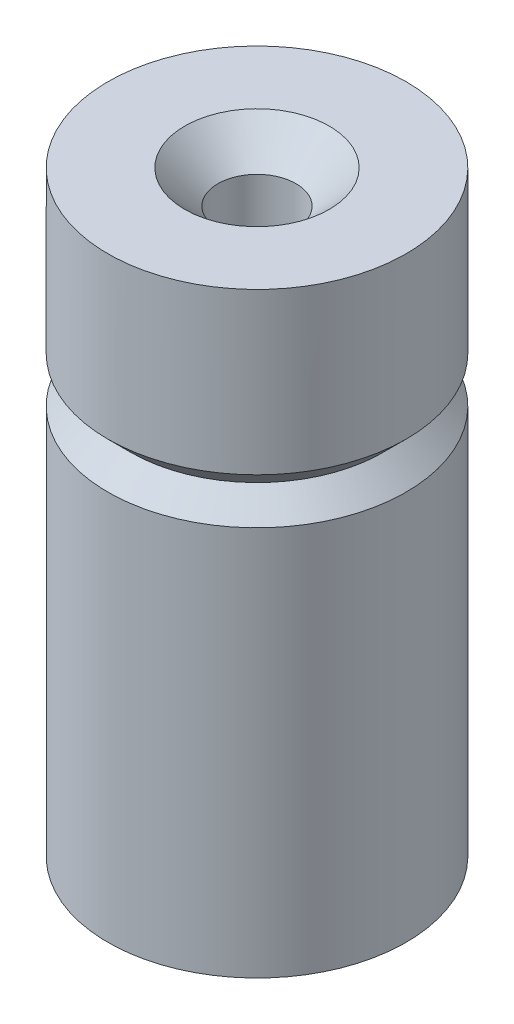
ISO-10303-21;
HEADER;
FILE_DESCRIPTION(('STEP AP214'),'2;1');
FILE_NAME('part.step','',(''),(''),'','','');
FILE_SCHEMA(('AUTOMOTIVE_DESIGN { 1 0 10303 214 1 1 1 1 }'));
ENDSEC;
DATA;
#1=APPLICATION_CONTEXT('core data for automotive mechanical design processes');
#2=APPLICATION_PROTOCOL_DEFINITION('international standard','automotive_design',2000,#1);
#3=PRODUCT_CONTEXT('',#1,'mechanical');
#4=PRODUCT('Part','Part','',(#3));
#5=PRODUCT_RELATED_PRODUCT_CATEGORY('part','',(#4));
#6=PRODUCT_DEFINITION_FORMATION('','',#4);
#7=PRODUCT_DEFINITION_CONTEXT('part definition',#1,'design');
#8=PRODUCT_DEFINITION('design','',#6,#7);
#9=PRODUCT_DEFINITION_SHAPE('','',#8);
#10=(LENGTH_UNIT() NAMED_UNIT(*) SI_UNIT(.MILLI.,.METRE.));
#11=(NAMED_UNIT(*) PLANE_ANGLE_UNIT() SI_UNIT($,.RADIAN.));
#12=(NAMED_UNIT(*) SI_UNIT($,.STERADIAN.) SOLID_ANGLE_UNIT());
#13=UNCERTAINTY_MEASURE_WITH_UNIT(LENGTH_MEASURE(1.E-05),#10,'distance_accuracy_value','');
#14=(GEOMETRIC_REPRESENTATION_CONTEXT(3) GLOBAL_UNCERTAINTY_ASSIGNED_CONTEXT((#13)) GLOBAL_UNIT_ASSIGNED_CONTEXT((#10,
#11,#12)) REPRESENTATION_CONTEXT('',''));
#15=CARTESIAN_POINT('',(0.,0.,0.));
#16=DIRECTION('',(0.,0.,1.));
#17=DIRECTION('',(1.,0.,0.));
#18=AXIS2_PLACEMENT_3D('',#15,#16,#17);
#19=CARTESIAN_POINT('',(0.,26.,0.));
#20=DIRECTION('',(0.,-1.,0.));
#21=DIRECTION('',(0.,0.,-1.));
#22=AXIS2_PLACEMENT_3D('',#19,#20,#21);
#23=CYLINDRICAL_SURFACE('',#22,6.5);
#24=CARTESIAN_POINT('',(0.,26.,0.));
#25=DIRECTION('',(0.,1.,0.));
#26=DIRECTION('',(0.,0.,1.));
#27=AXIS2_PLACEMENT_3D('',#24,#25,#26);
#28=CIRCLE('',#27,6.5);
#29=CARTESIAN_POINT('',(0.,26.,-6.5));
#30=VERTEX_POINT('',#29);
#31=EDGE_CURVE('E10',#30,#30,#28,.T.);
#32=CARTESIAN_POINT('',(0.,19.,0.));
#33=DIRECTION('',(0.,1.,0.));
#34=DIRECTION('',(0.,0.,1.));
#35=AXIS2_PLACEMENT_3D('',#32,#33,#34);
#36=CIRCLE('',#35,6.5);
#37=CARTESIAN_POINT('',(0.,19.,-6.5));
#38=VERTEX_POINT('',#37);
#39=EDGE_CURVE('E61',#38,#38,#36,.T.);
#40=CARTESIAN_POINT('',(0.,26.,-6.5));
#41=CARTESIAN_POINT('',(0.,25.9270833333333,-6.5));
#42=CARTESIAN_POINT('',(0.,25.8541666666667,-6.5));
#43=CARTESIAN_POINT('',(0.,25.7083333333333,-6.5));
#44=CARTESIAN_POINT('',(0.,25.6354166666667,-6.5));
#45=CARTESIAN_POINT('',(0.,25.4895833333333,-6.5));
#46=CARTESIAN_POINT('',(0.,25.4166666666667,-6.5));
#47=CARTESIAN_POINT('',(0.,25.2708333333333,-6.5));
#48=CARTESIAN_POINT('',(0.,25.1979166666667,-6.5));
#49=CARTESIAN_POINT('',(0.,25.0520833333333,-6.5));
#50=CARTESIAN_POINT('',(0.,24.9791666666667,-6.5));
#51=CARTESIAN_POINT('',(0.,24.8333333333333,-6.5));
#52=CARTESIAN_POINT('',(0.,24.7604166666667,-6.5));
#53=CARTESIAN_POINT('',(0.,24.6145833333333,-6.5));
#54=CARTESIAN_POINT('',(0.,24.5416666666667,-6.5));
#55=CARTESIAN_POINT('',(0.,24.3958333333333,-6.5));
#56=CARTESIAN_POINT('',(0.,24.3229166666667,-6.5));
#57=CARTESIAN_POINT('',(0.,24.1770833333333,-6.5));
#58=CARTESIAN_POINT('',(0.,24.1041666666667,-6.5));
#59=CARTESIAN_POINT('',(0.,23.9583333333333,-6.5));
#60=CARTESIAN_POINT('',(0.,23.8854166666667,-6.5));
#61=CARTESIAN_POINT('',(0.,23.7395833333333,-6.5));
#62=CARTESIAN_POINT('',(0.,23.6666666666667,-6.5));
#63=CARTESIAN_POINT('',(0.,23.5208333333333,-6.5));
#64=CARTESIAN_POINT('',(0.,23.4479166666667,-6.5));
#65=CARTESIAN_POINT('',(0.,23.3020833333333,-6.5));
#66=CARTESIAN_POINT('',(0.,23.2291666666667,-6.5));
#67=CARTESIAN_POINT('',(0.,23.0833333333333,-6.5));
#68=CARTESIAN_POINT('',(0.,23.0104166666667,-6.5));
#69=CARTESIAN_POINT('',(0.,22.8645833333333,-6.5));
#70=CARTESIAN_POINT('',(0.,22.7916666666667,-6.5));
#71=CARTESIAN_POINT('',(0.,22.6458333333333,-6.5));
#72=CARTESIAN_POINT('',(0.,22.5729166666667,-6.5));
#73=CARTESIAN_POINT('',(0.,22.4270833333333,-6.5));
#74=CARTESIAN_POINT('',(0.,22.3541666666667,-6.5));
#75=CARTESIAN_POINT('',(0.,22.2083333333333,-6.5));
#76=CARTESIAN_POINT('',(0.,22.1354166666667,-6.5));
#77=CARTESIAN_POINT('',(0.,21.9895833333333,-6.5));
#78=CARTESIAN_POINT('',(0.,21.9166666666667,-6.5));
#79=CARTESIAN_POINT('',(0.,21.7708333333333,-6.5));
#80=CARTESIAN_POINT('',(0.,21.6979166666667,-6.5));
#81=CARTESIAN_POINT('',(0.,21.5520833333333,-6.5));
#82=CARTESIAN_POINT('',(0.,21.4791666666667,-6.5));
#83=CARTESIAN_POINT('',(0.,21.3333333333333,-6.5));
#84=CARTESIAN_POINT('',(0.,21.2604166666667,-6.5));
#85=CARTESIAN_POINT('',(0.,21.1145833333333,-6.5));
#86=CARTESIAN_POINT('',(0.,21.0416666666667,-6.5));
#87=CARTESIAN_POINT('',(0.,20.8958333333333,-6.5));
#88=CARTESIAN_POINT('',(0.,20.8229166666667,-6.5));
#89=CARTESIAN_POINT('',(0.,20.6770833333333,-6.5));
#90=CARTESIAN_POINT('',(0.,20.6041666666667,-6.5));
#91=CARTESIAN_POINT('',(0.,20.4583333333333,-6.5));
#92=CARTESIAN_POINT('',(0.,20.3854166666667,-6.5));
#93=CARTESIAN_POINT('',(0.,20.2395833333333,-6.5));
#94=CARTESIAN_POINT('',(0.,20.1666666666667,-6.5));
#95=CARTESIAN_POINT('',(0.,20.0208333333333,-6.5));
#96=CARTESIAN_POINT('',(0.,19.9479166666667,-6.5));
#97=CARTESIAN_POINT('',(0.,19.8020833333333,-6.5));
#98=CARTESIAN_POINT('',(0.,19.7291666666667,-6.5));
#99=CARTESIAN_POINT('',(0.,19.5833333333333,-6.5));
#100=CARTESIAN_POINT('',(0.,19.5104166666667,-6.5));
#101=CARTESIAN_POINT('',(0.,19.3645833333333,-6.5));
#102=CARTESIAN_POINT('',(0.,19.2916666666667,-6.5));
#103=CARTESIAN_POINT('',(0.,19.1458333333333,-6.5));
#104=CARTESIAN_POINT('',(0.,19.0729166666667,-6.5));
#105=CARTESIAN_POINT('',(0.,19.,-6.5));
#106=B_SPLINE_CURVE_WITH_KNOTS('',3,(#40,#41,#42,#43,#44,#45,#46,#47,#48,#49,#50,#51,#52,#53,
#54,#55,#56,#57,#58,#59,#60,#61,#62,#63,#64,#65,#66,#67,#68,#69,#70,#71,#72,#73,#74,#75,#76,#77,
#78,#79,#80,#81,#82,#83,#84,#85,#86,#87,#88,#89,#90,#91,#92,#93,#94,#95,#96,#97,#98,#99,#100,
#101,#102,#103,#104,#105),.UNSPECIFIED.,.F.,.F.,(4,2,2,2,2,2,2,2,2,2,2,2,2,2,2,2,2,2,2,2,2,2,2,
2,2,2,2,2,2,2,2,2,4),(0.,0.21875,0.4375,0.656250000000001,0.875000000000001,1.09375,1.3125,
1.53125,1.75,1.96875,2.1875,2.40625,2.625,2.84375,3.0625,3.28125,3.5,3.71875,3.9375,4.15625,
4.375,4.59375,4.8125,5.03125,5.25,5.46875,5.6875,5.90625,6.125,6.34375,6.5625,6.78125,7.),.UNSPECIFIED.);
#107=EDGE_CURVE('BSEAM36',#30,#38,#106,.T.);
#108=ORIENTED_EDGE('',*,*,#31,.F.);
#109=ORIENTED_EDGE('',*,*,#39,.T.);
#110=ORIENTED_EDGE('',*,*,#107,.T.);
#111=ORIENTED_EDGE('',*,*,#107,.F.);
#112=EDGE_LOOP('',(#108,#110,#109,#111));
#113=FACE_BOUND('',#112,.T.);
#114=ADVANCED_FACE('F36',(#113),#23,.T.);
#115=CARTESIAN_POINT('',(0.,0.,0.));
#116=DIRECTION('',(0.,1.,0.));
#117=DIRECTION('',(0.,0.,1.));
#118=AXIS2_PLACEMENT_3D('',#115,#116,#117);
#119=CIRCLE('',#118,6.5);
#120=CARTESIAN_POINT('',(0.,0.,-6.5));
#121=VERTEX_POINT('',#120);
#122=EDGE_CURVE('E43',#121,#121,#119,.T.);
#123=CARTESIAN_POINT('',(0.,17.,0.));
#124=DIRECTION('',(0.,1.,0.));
#125=DIRECTION('',(0.,0.,1.));
#126=AXIS2_PLACEMENT_3D('',#123,#124,#125);
#127=CIRCLE('',#126,6.5);
#128=CARTESIAN_POINT('',(0.,17.,-6.5));
#129=VERTEX_POINT('',#128);
#130=EDGE_CURVE('E67',#129,#129,#127,.T.);
#131=CARTESIAN_POINT('',(0.,0.,-6.5));
#132=CARTESIAN_POINT('',(0.,0.177083333333333,-6.5));
#133=CARTESIAN_POINT('',(0.,0.354166666666667,-6.5));
#134=CARTESIAN_POINT('',(0.,0.708333333333334,-6.5));
#135=CARTESIAN_POINT('',(0.,0.885416666666668,-6.5));
#136=CARTESIAN_POINT('',(0.,1.23958333333333,-6.5));
#137=CARTESIAN_POINT('',(0.,1.41666666666667,-6.5));
#138=CARTESIAN_POINT('',(0.,1.77083333333334,-6.5));
#139=CARTESIAN_POINT('',(0.,1.94791666666667,-6.5));
#140=CARTESIAN_POINT('',(0.,2.30208333333334,-6.5));
#141=CARTESIAN_POINT('',(0.,2.47916666666667,-6.5));
#142=CARTESIAN_POINT('',(0.,2.83333333333334,-6.5));
#143=CARTESIAN_POINT('',(0.,3.01041666666667,-6.5));
#144=CARTESIAN_POINT('',(0.,3.36458333333334,-6.5));
#145=CARTESIAN_POINT('',(0.,3.54166666666667,-6.5));
#146=CARTESIAN_POINT('',(0.,3.89583333333334,-6.5));
#147=CARTESIAN_POINT('',(0.,4.07291666666667,-6.5));
#148=CARTESIAN_POINT('',(0.,4.42708333333334,-6.5));
#149=CARTESIAN_POINT('',(0.,4.60416666666667,-6.5));
#150=CARTESIAN_POINT('',(0.,4.95833333333334,-6.5));
#151=CARTESIAN_POINT('',(0.,5.13541666666667,-6.5));
#152=CARTESIAN_POINT('',(0.,5.48958333333334,-6.5));
#153=CARTESIAN_POINT('',(0.,5.66666666666667,-6.5));
#154=CARTESIAN_POINT('',(0.,6.02083333333334,-6.5));
#155=CARTESIAN_POINT('',(0.,6.19791666666667,-6.5));
#156=CARTESIAN_POINT('',(0.,6.55208333333334,-6.5));
#157=CARTESIAN_POINT('',(0.,6.72916666666667,-6.5));
#158=CARTESIAN_POINT('',(0.,7.08333333333334,-6.5));
#159=CARTESIAN_POINT('',(0.,7.26041666666667,-6.5));
#160=CARTESIAN_POINT('',(0.,7.61458333333334,-6.5));
#161=CARTESIAN_POINT('',(0.,7.79166666666667,-6.5));
#162=CARTESIAN_POINT('',(0.,8.14583333333334,-6.5));
#163=CARTESIAN_POINT('',(0.,8.32291666666667,-6.5));
#164=CARTESIAN_POINT('',(0.,8.67708333333334,-6.5));
#165=CARTESIAN_POINT('',(0.,8.85416666666667,-6.5));
#166=CARTESIAN_POINT('',(0.,9.20833333333334,-6.5));
#167=CARTESIAN_POINT('',(0.,9.38541666666667,-6.5));
#168=CARTESIAN_POINT('',(0.,9.73958333333334,-6.5));
#169=CARTESIAN_POINT('',(0.,9.91666666666667,-6.5));
#170=CARTESIAN_POINT('',(0.,10.2708333333333,-6.5));
#171=CARTESIAN_POINT('',(0.,10.4479166666667,-6.5));
#172=CARTESIAN_POINT('',(0.,10.8020833333333,-6.5));
#173=CARTESIAN_POINT('',(0.,10.9791666666667,-6.5));
#174=CARTESIAN_POINT('',(0.,11.3333333333333,-6.5));
#175=CARTESIAN_POINT('',(0.,11.5104166666667,-6.5));
#176=CARTESIAN_POINT('',(0.,11.8645833333333,-6.5));
#177=CARTESIAN_POINT('',(0.,12.0416666666667,-6.5));
#178=CARTESIAN_POINT('',(0.,12.3958333333333,-6.5));
#179=CARTESIAN_POINT('',(0.,12.5729166666667,-6.5));
#180=CARTESIAN_POINT('',(0.,12.9270833333333,-6.5));
#181=CARTESIAN_POINT('',(0.,13.1041666666667,-6.5));
#182=CARTESIAN_POINT('',(0.,13.4583333333333,-6.5));
#183=CARTESIAN_POINT('',(0.,13.6354166666667,-6.5));
#184=CARTESIAN_POINT('',(0.,13.9895833333333,-6.5));
#185=CARTESIAN_POINT('',(0.,14.1666666666667,-6.5));
#186=CARTESIAN_POINT('',(0.,14.5208333333333,-6.5));
#187=CARTESIAN_POINT('',(0.,14.6979166666667,-6.5));
#188=CARTESIAN_POINT('',(0.,15.0520833333333,-6.5));
#189=CARTESIAN_POINT('',(0.,15.2291666666667,-6.5));
#190=CARTESIAN_POINT('',(0.,15.5833333333333,-6.5));
#191=CARTESIAN_POINT('',(0.,15.7604166666667,-6.5));
#192=CARTESIAN_POINT('',(0.,16.1145833333333,-6.5));
#193=CARTESIAN_POINT('',(0.,16.2916666666667,-6.5));
#194=CARTESIAN_POINT('',(0.,16.6458333333333,-6.5));
#195=CARTESIAN_POINT('',(0.,16.8229166666667,-6.5));
#196=CARTESIAN_POINT('',(0.,17.,-6.5));
#197=B_SPLINE_CURVE_WITH_KNOTS('',3,(#131,#132,#133,#134,#135,#136,#137,#138,#139,#140,#141,
#142,#143,#144,#145,#146,#147,#148,#149,#150,#151,#152,#153,#154,#155,#156,#157,#158,#159,#160,
#161,#162,#163,#164,#165,#166,#167,#168,#169,#170,#171,#172,#173,#174,#175,#176,#177,#178,#179,
#180,#181,#182,#183,#184,#185,#186,#187,#188,#189,#190,#191,#192,#193,#194,#195,#196),
.UNSPECIFIED.,.F.,.F.,(4,2,2,2,2,2,2,2,2,2,2,2,2,2,2,2,2,2,2,2,2,2,2,2,2,2,2,2,2,2,2,2,4),(0.,
0.53125,1.0625,1.59375,2.125,2.65625,3.1875,3.71875,4.25,4.78125,5.3125,5.84375000000001,
6.37500000000001,6.90625,7.43750000000001,7.96875,8.50000000000001,9.03125000000001,
9.56250000000001,10.09375,10.625,11.15625,11.6875,12.21875,12.75,13.28125,13.8125,14.34375,
14.875,15.40625,15.9375,16.46875,17.),.UNSPECIFIED.);
#198=EDGE_CURVE('BSEAM74',#121,#129,#197,.T.);
#199=ORIENTED_EDGE('',*,*,#122,.T.);
#200=ORIENTED_EDGE('',*,*,#130,.F.);
#201=ORIENTED_EDGE('',*,*,#198,.T.);
#202=ORIENTED_EDGE('',*,*,#198,.F.);
#203=EDGE_LOOP('',(#199,#201,#200,#202));
#204=FACE_BOUND('',#203,.T.);
#205=ADVANCED_FACE('F74',(#204),#23,.T.);
#206=CARTESIAN_POINT('',(0.,26.,0.));
#207=DIRECTION('',(0.,1.,0.));
#208=DIRECTION('',(0.,0.,1.));
#209=AXIS2_PLACEMENT_3D('',#206,#207,#208);
#210=PLANE('',#209);
#211=CARTESIAN_POINT('',(0.,26.,0.));
#212=DIRECTION('',(0.,1.,0.));
#213=DIRECTION('',(0.,0.,1.));
#214=AXIS2_PLACEMENT_3D('',#211,#212,#213);
#215=CIRCLE('',#214,3.15);
#216=CARTESIAN_POINT('',(0.,26.,3.15));
#217=VERTEX_POINT('',#216);
#218=EDGE_CURVE('E58',#217,#217,#215,.T.);
#219=ORIENTED_EDGE('',*,*,#218,.F.);
#220=EDGE_LOOP('',(#219));
#221=FACE_BOUND('',#220,.T.);
#222=ORIENTED_EDGE('',*,*,#31,.T.);
#223=EDGE_LOOP('',(#222));
#224=FACE_BOUND('',#223,.T.);
#225=ADVANCED_FACE('F76',(#221,#224),#210,.T.);
#226=CARTESIAN_POINT('',(0.,0.,0.));
#227=DIRECTION('',(0.,1.,0.));
#228=DIRECTION('',(0.,0.,1.));
#229=AXIS2_PLACEMENT_3D('',#226,#227,#228);
#230=PLANE('',#229);
#231=CARTESIAN_POINT('',(0.,0.,0.));
#232=DIRECTION('',(0.,-1.,0.));
#233=DIRECTION('',(0.,0.,-1.));
#234=AXIS2_PLACEMENT_3D('',#231,#232,#233);
#235=CIRCLE('',#234,2.85);
#236=CARTESIAN_POINT('',(0.,0.,-2.85));
#237=VERTEX_POINT('',#236);
#238=EDGE_CURVE('E50',#237,#237,#235,.T.);
#239=ORIENTED_EDGE('',*,*,#238,.F.);
#240=EDGE_LOOP('',(#239));
#241=FACE_BOUND('',#240,.T.);
#242=ORIENTED_EDGE('',*,*,#122,.F.);
#243=EDGE_LOOP('',(#242));
#244=FACE_BOUND('',#243,.T.);
#245=ADVANCED_FACE('F82',(#241,#244),#230,.F.);
#246=CARTESIAN_POINT('',(0.,3.5,0.));
#247=DIRECTION('',(0.,-1.,0.));
#248=DIRECTION('',(0.,0.,-1.));
#249=AXIS2_PLACEMENT_3D('',#246,#247,#248);
#250=CYLINDRICAL_SURFACE('',#249,2.85);
#251=CARTESIAN_POINT('',(0.,3.5,0.));
#252=DIRECTION('',(0.,-1.,0.));
#253=DIRECTION('',(0.,0.,-1.));
#254=AXIS2_PLACEMENT_3D('',#251,#252,#253);
#255=CIRCLE('',#254,2.85);
#256=CARTESIAN_POINT('',(0.,3.5,-2.85));
#257=VERTEX_POINT('',#256);
#258=EDGE_CURVE('E48',#257,#257,#255,.T.);
#259=ORIENTED_EDGE('',*,*,#258,.F.);
#260=EDGE_LOOP('',(#259));
#261=FACE_BOUND('',#260,.T.);
#262=ORIENTED_EDGE('',*,*,#238,.T.);
#263=EDGE_LOOP('',(#262));
#264=FACE_BOUND('',#263,.T.);
#265=ADVANCED_FACE('F89',(#261,#264),#250,.F.);
#266=CARTESIAN_POINT('',(0.,3.5,0.));
#267=DIRECTION('',(0.,-1.,0.));
#268=DIRECTION('',(0.,0.,-1.));
#269=AXIS2_PLACEMENT_3D('',#266,#267,#268);
#270=PLANE('',#269);
#271=CARTESIAN_POINT('',(0.,3.5,0.));
#272=DIRECTION('',(0.,-1.,0.));
#273=DIRECTION('',(0.,0.,-1.));
#274=AXIS2_PLACEMENT_3D('',#271,#272,#273);
#275=CIRCLE('',#274,1.69999999999999);
#276=CARTESIAN_POINT('',(0.,3.5,-1.69999999999999));
#277=VERTEX_POINT('',#276);
#278=EDGE_CURVE('E39',#277,#277,#275,.T.);
#279=ORIENTED_EDGE('',*,*,#278,.F.);
#280=EDGE_LOOP('',(#279));
#281=FACE_BOUND('',#280,.T.);
#282=ORIENTED_EDGE('',*,*,#258,.T.);
#283=EDGE_LOOP('',(#282));
#284=FACE_BOUND('',#283,.T.);
#285=ADVANCED_FACE('F94',(#281,#284),#270,.T.);
#286=CARTESIAN_POINT('',(0.,26.,0.));
#287=DIRECTION('',(0.,1.,0.));
#288=DIRECTION('',(0.,0.,1.));
#289=AXIS2_PLACEMENT_3D('',#286,#287,#288);
#290=CYLINDRICAL_SURFACE('',#289,1.69999999999999);
#291=ORIENTED_EDGE('',*,*,#278,.T.);
#292=EDGE_LOOP('',(#291));
#293=FACE_BOUND('',#292,.T.);
#294=CARTESIAN_POINT('',(0.,24.55,0.));
#295=DIRECTION('',(0.,1.,0.));
#296=DIRECTION('',(0.,0.,1.));
#297=AXIS2_PLACEMENT_3D('',#294,#295,#296);
#298=CIRCLE('',#297,1.69999999999999);
#299=CARTESIAN_POINT('',(0.,24.55,1.69999999999999));
#300=VERTEX_POINT('',#299);
#301=EDGE_CURVE('E55',#300,#300,#298,.T.);
#302=ORIENTED_EDGE('',*,*,#301,.T.);
#303=EDGE_LOOP('',(#302));
#304=FACE_BOUND('',#303,.T.);
#305=ADVANCED_FACE('F101',(#293,#304),#290,.F.);
#306=CARTESIAN_POINT('',(0.,26.,0.));
#307=DIRECTION('',(0.,1.,0.));
#308=DIRECTION('',(0.,0.,1.));
#309=AXIS2_PLACEMENT_3D('',#306,#307,#308);
#310=CONICAL_SURFACE('',#309,3.15,0.785398163397449);
#311=ORIENTED_EDGE('',*,*,#301,.F.);
#312=EDGE_LOOP('',(#311));
#313=FACE_BOUND('',#312,.T.);
#314=ORIENTED_EDGE('',*,*,#218,.T.);
#315=EDGE_LOOP('',(#314));
#316=FACE_BOUND('',#315,.T.);
#317=ADVANCED_FACE('F105',(#313,#316),#310,.F.);
#318=CARTESIAN_POINT('',(0.,19.,0.));
#319=DIRECTION('',(0.,1.,0.));
#320=DIRECTION('',(0.,0.,1.));
#321=AXIS2_PLACEMENT_3D('',#318,#319,#320);
#322=CONICAL_SURFACE('',#321,6.5,0.785398163397448);
#323=CARTESIAN_POINT('',(0.,18.,0.));
#324=DIRECTION('',(0.,1.,0.));
#325=DIRECTION('',(0.,0.,1.));
#326=AXIS2_PLACEMENT_3D('',#323,#324,#325);
#327=CIRCLE('',#326,5.5);
#328=CARTESIAN_POINT('',(0.,18.,5.5));
#329=VERTEX_POINT('',#328);
#330=EDGE_CURVE('E64',#329,#329,#327,.T.);
#331=ORIENTED_EDGE('',*,*,#330,.T.);
#332=EDGE_LOOP('',(#331));
#333=FACE_BOUND('',#332,.T.);
#334=ORIENTED_EDGE('',*,*,#39,.F.);
#335=EDGE_LOOP('',(#334));
#336=FACE_BOUND('',#335,.T.);
#337=ADVANCED_FACE('F109',(#333,#336),#322,.T.);
#338=CARTESIAN_POINT('',(0.,18.,0.));
#339=DIRECTION('',(0.,-1.,0.));
#340=DIRECTION('',(0.,0.,-1.));
#341=AXIS2_PLACEMENT_3D('',#338,#339,#340);
#342=CONICAL_SURFACE('',#341,5.5,0.785398163397455);
#343=ORIENTED_EDGE('',*,*,#130,.T.);
#344=EDGE_LOOP('',(#343));
#345=FACE_BOUND('',#344,.T.);
#346=ORIENTED_EDGE('',*,*,#330,.F.);
#347=EDGE_LOOP('',(#346));
#348=FACE_BOUND('',#347,.T.);
#349=ADVANCED_FACE('F71',(#345,#348),#342,.T.);
#350=CLOSED_SHELL('',(#114,#205,#225,#245,#265,#285,#305,#317,#337,#349));
#351=MANIFOLD_SOLID_BREP('B2',#350);
#352=ADVANCED_BREP_SHAPE_REPRESENTATION('',(#18,#351),#14);
#353=SHAPE_DEFINITION_REPRESENTATION(#9,#352);
ENDSEC;
END-ISO-10303-21;
